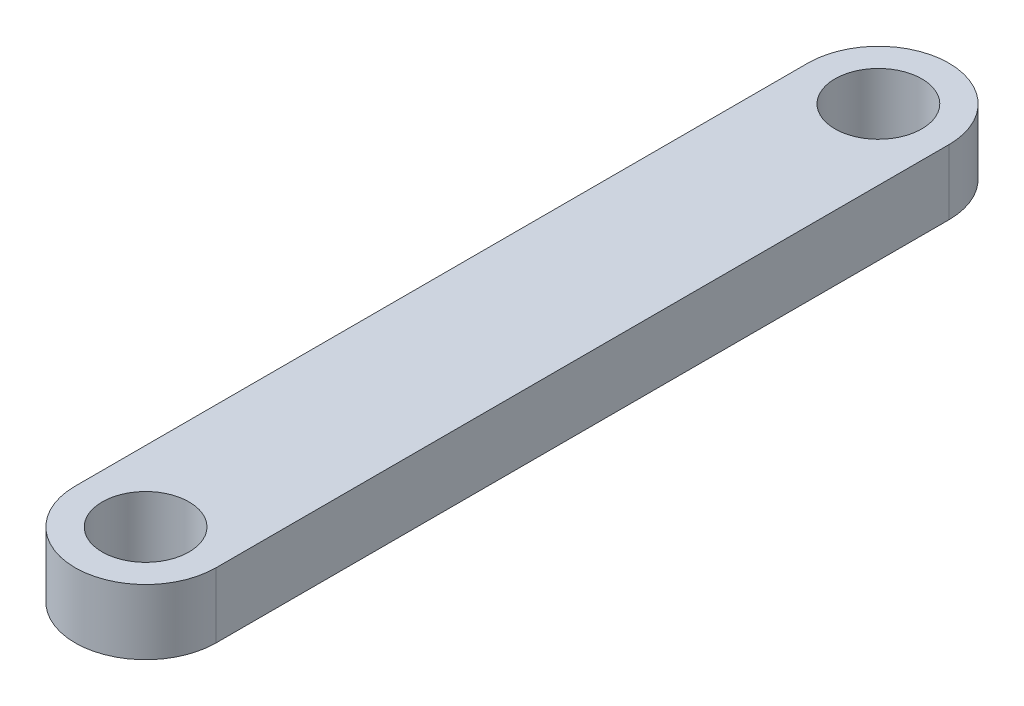
ISO-10303-21;
HEADER;
FILE_DESCRIPTION(('STEP AP214'),'2;1');
FILE_NAME('part.step','',(''),(''),'','','');
FILE_SCHEMA(('AUTOMOTIVE_DESIGN { 1 0 10303 214 1 1 1 1 }'));
ENDSEC;
DATA;
#1=APPLICATION_CONTEXT('core data for automotive mechanical design processes');
#2=APPLICATION_PROTOCOL_DEFINITION('international standard','automotive_design',2000,#1);
#3=PRODUCT_CONTEXT('',#1,'mechanical');
#4=PRODUCT('Part','Part','',(#3));
#5=PRODUCT_RELATED_PRODUCT_CATEGORY('part','',(#4));
#6=PRODUCT_DEFINITION_FORMATION('','',#4);
#7=PRODUCT_DEFINITION_CONTEXT('part definition',#1,'design');
#8=PRODUCT_DEFINITION('design','',#6,#7);
#9=PRODUCT_DEFINITION_SHAPE('','',#8);
#10=(LENGTH_UNIT() NAMED_UNIT(*) SI_UNIT(.MILLI.,.METRE.));
#11=(NAMED_UNIT(*) PLANE_ANGLE_UNIT() SI_UNIT($,.RADIAN.));
#12=(NAMED_UNIT(*) SI_UNIT($,.STERADIAN.) SOLID_ANGLE_UNIT());
#13=UNCERTAINTY_MEASURE_WITH_UNIT(LENGTH_MEASURE(1.E-05),#10,'distance_accuracy_value','');
#14=(GEOMETRIC_REPRESENTATION_CONTEXT(3) GLOBAL_UNCERTAINTY_ASSIGNED_CONTEXT((#13)) GLOBAL_UNIT_ASSIGNED_CONTEXT((#10,
#11,#12)) REPRESENTATION_CONTEXT('',''));
#15=CARTESIAN_POINT('',(0.,0.,0.));
#16=DIRECTION('',(0.,0.,1.));
#17=DIRECTION('',(1.,0.,0.));
#18=AXIS2_PLACEMENT_3D('',#15,#16,#17);
#19=CARTESIAN_POINT('',(0.,0.,16.875));
#20=DIRECTION('',(0.,1.,0.));
#21=DIRECTION('',(0.,0.,-1.));
#22=AXIS2_PLACEMENT_3D('',#19,#20,#21);
#23=PLANE('',#22);
#24=CARTESIAN_POINT('',(0.,0.,0.));
#25=DIRECTION('',(0.,1.,0.));
#26=DIRECTION('',(1.,0.,0.));
#27=AXIS2_PLACEMENT_3D('',#24,#25,#26);
#28=CIRCLE('',#27,2.);
#29=CARTESIAN_POINT('',(-2.,0.,0.));
#30=VERTEX_POINT('',#29);
#31=EDGE_CURVE('E124',#30,#30,#28,.T.);
#32=ORIENTED_EDGE('',*,*,#31,.T.);
#33=EDGE_LOOP('',(#32));
#34=FACE_BOUND('',#33,.T.);
#35=CARTESIAN_POINT('',(0.,0.,33.75));
#36=DIRECTION('',(0.,1.,0.));
#37=DIRECTION('',(1.,0.,0.));
#38=AXIS2_PLACEMENT_3D('',#35,#36,#37);
#39=CIRCLE('',#38,2.);
#40=CARTESIAN_POINT('',(-2.,0.,33.75));
#41=VERTEX_POINT('',#40);
#42=EDGE_CURVE('E136',#41,#41,#39,.T.);
#43=ORIENTED_EDGE('',*,*,#42,.T.);
#44=EDGE_LOOP('',(#43));
#45=FACE_BOUND('',#44,.T.);
#46=CARTESIAN_POINT('',(0.,0.,33.75));
#47=DIRECTION('',(0.,-1.,0.));
#48=DIRECTION('',(1.,0.,0.));
#49=AXIS2_PLACEMENT_3D('',#46,#47,#48);
#50=CIRCLE('',#49,3.25);
#51=CARTESIAN_POINT('',(3.25,0.,33.75));
#52=VERTEX_POINT('',#51);
#53=CARTESIAN_POINT('',(-3.25,0.,33.75));
#54=VERTEX_POINT('',#53);
#55=EDGE_CURVE('E49',#52,#54,#50,.T.);
#56=ORIENTED_EDGE('',*,*,#55,.T.);
#57=DIRECTION('',(0.,0.,-1.));
#58=VECTOR('',#57,1.);
#59=CARTESIAN_POINT('',(-3.25,0.,33.75));
#60=LINE('',#59,#58);
#61=CARTESIAN_POINT('',(-3.25,0.,0.));
#62=VERTEX_POINT('',#61);
#63=EDGE_CURVE('E98',#54,#62,#60,.T.);
#64=ORIENTED_EDGE('',*,*,#63,.T.);
#65=CARTESIAN_POINT('',(0.,0.,0.));
#66=DIRECTION('',(0.,-1.,0.));
#67=DIRECTION('',(-1.,0.,0.));
#68=AXIS2_PLACEMENT_3D('',#65,#66,#67);
#69=CIRCLE('',#68,3.25);
#70=CARTESIAN_POINT('',(3.25,0.,0.));
#71=VERTEX_POINT('',#70);
#72=EDGE_CURVE('E108',#62,#71,#69,.T.);
#73=ORIENTED_EDGE('',*,*,#72,.T.);
#74=DIRECTION('',(0.,0.,1.));
#75=VECTOR('',#74,1.);
#76=CARTESIAN_POINT('',(3.25,0.,0.));
#77=LINE('',#76,#75);
#78=EDGE_CURVE('E133',#71,#52,#77,.T.);
#79=ORIENTED_EDGE('',*,*,#78,.T.);
#80=EDGE_LOOP('',(#56,#64,#73,#79));
#81=FACE_BOUND('',#80,.T.);
#82=ADVANCED_FACE('F50',(#34,#45,#81),#23,.F.);
#83=CARTESIAN_POINT('',(0.,3.,16.875));
#84=DIRECTION('',(0.,1.,0.));
#85=DIRECTION('',(0.,0.,-1.));
#86=AXIS2_PLACEMENT_3D('',#83,#84,#85);
#87=PLANE('',#86);
#88=CARTESIAN_POINT('',(0.,3.,0.));
#89=DIRECTION('',(0.,1.,0.));
#90=DIRECTION('',(1.,0.,0.));
#91=AXIS2_PLACEMENT_3D('',#88,#89,#90);
#92=CIRCLE('',#91,2.);
#93=CARTESIAN_POINT('',(-2.,3.,0.));
#94=VERTEX_POINT('',#93);
#95=EDGE_CURVE('E126',#94,#94,#92,.T.);
#96=ORIENTED_EDGE('',*,*,#95,.F.);
#97=EDGE_LOOP('',(#96));
#98=FACE_BOUND('',#97,.T.);
#99=CARTESIAN_POINT('',(0.,3.,33.75));
#100=DIRECTION('',(0.,1.,0.));
#101=DIRECTION('',(1.,0.,0.));
#102=AXIS2_PLACEMENT_3D('',#99,#100,#101);
#103=CIRCLE('',#102,2.);
#104=CARTESIAN_POINT('',(-2.,3.,33.75));
#105=VERTEX_POINT('',#104);
#106=EDGE_CURVE('E130',#105,#105,#103,.T.);
#107=ORIENTED_EDGE('',*,*,#106,.F.);
#108=EDGE_LOOP('',(#107));
#109=FACE_BOUND('',#108,.T.);
#110=CARTESIAN_POINT('',(0.,3.,33.75));
#111=DIRECTION('',(0.,-1.,0.));
#112=DIRECTION('',(1.,0.,0.));
#113=AXIS2_PLACEMENT_3D('',#110,#111,#112);
#114=CIRCLE('',#113,3.25);
#115=CARTESIAN_POINT('',(3.25,3.,33.75));
#116=VERTEX_POINT('',#115);
#117=CARTESIAN_POINT('',(-3.25,3.,33.75));
#118=VERTEX_POINT('',#117);
#119=EDGE_CURVE('E11',#116,#118,#114,.T.);
#120=ORIENTED_EDGE('',*,*,#119,.F.);
#121=DIRECTION('',(0.,0.,1.));
#122=VECTOR('',#121,1.);
#123=CARTESIAN_POINT('',(3.25,3.,0.));
#124=LINE('',#123,#122);
#125=CARTESIAN_POINT('',(3.25,3.,0.));
#126=VERTEX_POINT('',#125);
#127=EDGE_CURVE('E135',#126,#116,#124,.T.);
#128=ORIENTED_EDGE('',*,*,#127,.F.);
#129=CARTESIAN_POINT('',(0.,3.,0.));
#130=DIRECTION('',(0.,-1.,0.));
#131=DIRECTION('',(-1.,0.,0.));
#132=AXIS2_PLACEMENT_3D('',#129,#130,#131);
#133=CIRCLE('',#132,3.25);
#134=CARTESIAN_POINT('',(-3.25,3.,0.));
#135=VERTEX_POINT('',#134);
#136=EDGE_CURVE('E106',#135,#126,#133,.T.);
#137=ORIENTED_EDGE('',*,*,#136,.F.);
#138=DIRECTION('',(0.,0.,-1.));
#139=VECTOR('',#138,1.);
#140=CARTESIAN_POINT('',(-3.25,3.,33.75));
#141=LINE('',#140,#139);
#142=EDGE_CURVE('E102',#118,#135,#141,.T.);
#143=ORIENTED_EDGE('',*,*,#142,.F.);
#144=EDGE_LOOP('',(#120,#128,#137,#143));
#145=FACE_BOUND('',#144,.T.);
#146=ADVANCED_FACE('F196',(#98,#109,#145),#87,.T.);
#147=CARTESIAN_POINT('',(0.,0.,33.75));
#148=DIRECTION('',(0.,-1.,0.));
#149=DIRECTION('',(1.,0.,0.));
#150=AXIS2_PLACEMENT_3D('',#147,#148,#149);
#151=CYLINDRICAL_SURFACE('',#150,3.25);
#152=ORIENTED_EDGE('',*,*,#55,.F.);
#153=DIRECTION('',(0.,1.,0.));
#154=VECTOR('',#153,1.);
#155=CARTESIAN_POINT('',(3.25,0.,33.75));
#156=LINE('',#155,#154);
#157=EDGE_CURVE('E129',#52,#116,#156,.T.);
#158=ORIENTED_EDGE('',*,*,#157,.T.);
#159=ORIENTED_EDGE('',*,*,#119,.T.);
#160=DIRECTION('',(0.,1.,0.));
#161=VECTOR('',#160,1.);
#162=CARTESIAN_POINT('',(-3.25,0.,33.75));
#163=LINE('',#162,#161);
#164=EDGE_CURVE('E64',#54,#118,#163,.T.);
#165=ORIENTED_EDGE('',*,*,#164,.F.);
#166=EDGE_LOOP('',(#152,#158,#159,#165));
#167=FACE_BOUND('',#166,.T.);
#168=ADVANCED_FACE('F187',(#167),#151,.T.);
#169=CARTESIAN_POINT('',(-3.25,0.,33.75));
#170=DIRECTION('',(-1.,0.,0.));
#171=DIRECTION('',(0.,0.,-1.));
#172=AXIS2_PLACEMENT_3D('',#169,#170,#171);
#173=PLANE('',#172);
#174=ORIENTED_EDGE('',*,*,#63,.F.);
#175=ORIENTED_EDGE('',*,*,#164,.T.);
#176=ORIENTED_EDGE('',*,*,#142,.T.);
#177=DIRECTION('',(0.,1.,0.));
#178=VECTOR('',#177,1.);
#179=CARTESIAN_POINT('',(-3.25,0.,0.));
#180=LINE('',#179,#178);
#181=EDGE_CURVE('E94',#62,#135,#180,.T.);
#182=ORIENTED_EDGE('',*,*,#181,.F.);
#183=EDGE_LOOP('',(#174,#175,#176,#182));
#184=FACE_BOUND('',#183,.T.);
#185=ADVANCED_FACE('F100',(#184),#173,.T.);
#186=CARTESIAN_POINT('',(0.,0.,0.));
#187=DIRECTION('',(0.,-1.,0.));
#188=DIRECTION('',(-1.,0.,0.));
#189=AXIS2_PLACEMENT_3D('',#186,#187,#188);
#190=CYLINDRICAL_SURFACE('',#189,3.25);
#191=ORIENTED_EDGE('',*,*,#72,.F.);
#192=ORIENTED_EDGE('',*,*,#181,.T.);
#193=ORIENTED_EDGE('',*,*,#136,.T.);
#194=DIRECTION('',(0.,1.,0.));
#195=VECTOR('',#194,1.);
#196=CARTESIAN_POINT('',(3.25,0.,0.));
#197=LINE('',#196,#195);
#198=EDGE_CURVE('E112',#71,#126,#197,.T.);
#199=ORIENTED_EDGE('',*,*,#198,.F.);
#200=EDGE_LOOP('',(#191,#192,#193,#199));
#201=FACE_BOUND('',#200,.T.);
#202=ADVANCED_FACE('F110',(#201),#190,.T.);
#203=CARTESIAN_POINT('',(3.25,0.,0.));
#204=DIRECTION('',(1.,0.,0.));
#205=DIRECTION('',(0.,0.,1.));
#206=AXIS2_PLACEMENT_3D('',#203,#204,#205);
#207=PLANE('',#206);
#208=ORIENTED_EDGE('',*,*,#78,.F.);
#209=ORIENTED_EDGE('',*,*,#198,.T.);
#210=ORIENTED_EDGE('',*,*,#127,.T.);
#211=ORIENTED_EDGE('',*,*,#157,.F.);
#212=EDGE_LOOP('',(#208,#209,#210,#211));
#213=FACE_BOUND('',#212,.T.);
#214=ADVANCED_FACE('F163',(#213),#207,.T.);
#215=CARTESIAN_POINT('',(0.,0.,33.75));
#216=DIRECTION('',(0.,-1.,0.));
#217=DIRECTION('',(1.,0.,0.));
#218=AXIS2_PLACEMENT_3D('',#215,#216,#217);
#219=CYLINDRICAL_SURFACE('',#218,2.);
#220=ORIENTED_EDGE('',*,*,#42,.F.);
#221=EDGE_LOOP('',(#220));
#222=FACE_BOUND('',#221,.T.);
#223=ORIENTED_EDGE('',*,*,#106,.T.);
#224=EDGE_LOOP('',(#223));
#225=FACE_BOUND('',#224,.T.);
#226=ADVANCED_FACE('F155',(#222,#225),#219,.F.);
#227=CARTESIAN_POINT('',(0.,0.,0.));
#228=DIRECTION('',(0.,-1.,0.));
#229=DIRECTION('',(1.,0.,0.));
#230=AXIS2_PLACEMENT_3D('',#227,#228,#229);
#231=CYLINDRICAL_SURFACE('',#230,2.);
#232=ORIENTED_EDGE('',*,*,#31,.F.);
#233=EDGE_LOOP('',(#232));
#234=FACE_BOUND('',#233,.T.);
#235=ORIENTED_EDGE('',*,*,#95,.T.);
#236=EDGE_LOOP('',(#235));
#237=FACE_BOUND('',#236,.T.);
#238=ADVANCED_FACE('F148',(#234,#237),#231,.F.);
#239=CLOSED_SHELL('',(#82,#146,#168,#185,#202,#214,#226,#238));
#240=MANIFOLD_SOLID_BREP('B2',#239);
#241=ADVANCED_BREP_SHAPE_REPRESENTATION('',(#18,#240),#14);
#242=SHAPE_DEFINITION_REPRESENTATION(#9,#241);
ENDSEC;
END-ISO-10303-21;
